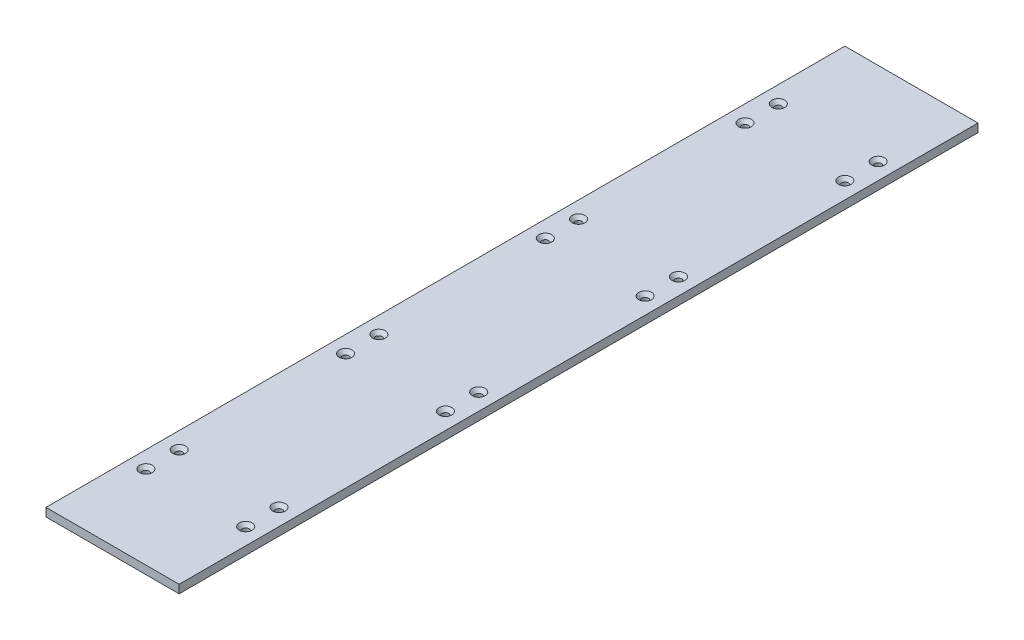
ISO-10303-21;
HEADER;
FILE_DESCRIPTION(('STEP AP214'),'2;1');
FILE_NAME('part.step','',(''),(''),'','','');
FILE_SCHEMA(('AUTOMOTIVE_DESIGN { 1 0 10303 214 1 1 1 1 }'));
ENDSEC;
DATA;
#1=APPLICATION_CONTEXT('core data for automotive mechanical design processes');
#2=APPLICATION_PROTOCOL_DEFINITION('international standard','automotive_design',2000,#1);
#3=PRODUCT_CONTEXT('',#1,'mechanical');
#4=PRODUCT('Part','Part','',(#3));
#5=PRODUCT_RELATED_PRODUCT_CATEGORY('part','',(#4));
#6=PRODUCT_DEFINITION_FORMATION('','',#4);
#7=PRODUCT_DEFINITION_CONTEXT('part definition',#1,'design');
#8=PRODUCT_DEFINITION('design','',#6,#7);
#9=PRODUCT_DEFINITION_SHAPE('','',#8);
#10=(LENGTH_UNIT() NAMED_UNIT(*) SI_UNIT(.MILLI.,.METRE.));
#11=(NAMED_UNIT(*) PLANE_ANGLE_UNIT() SI_UNIT($,.RADIAN.));
#12=(NAMED_UNIT(*) SI_UNIT($,.STERADIAN.) SOLID_ANGLE_UNIT());
#13=UNCERTAINTY_MEASURE_WITH_UNIT(LENGTH_MEASURE(1.E-05),#10,'distance_accuracy_value','');
#14=(GEOMETRIC_REPRESENTATION_CONTEXT(3) GLOBAL_UNCERTAINTY_ASSIGNED_CONTEXT((#13)) GLOBAL_UNIT_ASSIGNED_CONTEXT((#10,
#11,#12)) REPRESENTATION_CONTEXT('',''));
#15=CARTESIAN_POINT('',(0.,0.,0.));
#16=DIRECTION('',(0.,0.,1.));
#17=DIRECTION('',(1.,0.,0.));
#18=AXIS2_PLACEMENT_3D('',#15,#16,#17);
#19=CARTESIAN_POINT('',(50.8,3.175,304.8));
#20=DIRECTION('',(-1.,0.,0.));
#21=DIRECTION('',(0.,0.,1.));
#22=AXIS2_PLACEMENT_3D('',#19,#20,#21);
#23=PLANE('',#22);
#24=DIRECTION('',(0.,0.,-1.));
#25=VECTOR('',#24,1.);
#26=CARTESIAN_POINT('',(50.8,-3.175,304.8));
#27=LINE('',#26,#25);
#28=CARTESIAN_POINT('',(50.8,-3.175,304.8));
#29=VERTEX_POINT('',#28);
#30=CARTESIAN_POINT('',(50.8,-3.175,-304.8));
#31=VERTEX_POINT('',#30);
#32=EDGE_CURVE('E107',#29,#31,#27,.T.);
#33=ORIENTED_EDGE('',*,*,#32,.T.);
#34=DIRECTION('',(0.,-1.,0.));
#35=VECTOR('',#34,1.);
#36=CARTESIAN_POINT('',(50.8,3.175,-304.8));
#37=LINE('',#36,#35);
#38=CARTESIAN_POINT('',(50.8,3.175,-304.8));
#39=VERTEX_POINT('',#38);
#40=EDGE_CURVE('E11',#39,#31,#37,.T.);
#41=ORIENTED_EDGE('',*,*,#40,.F.);
#42=DIRECTION('',(0.,0.,-1.));
#43=VECTOR('',#42,1.);
#44=CARTESIAN_POINT('',(50.8,3.175,304.8));
#45=LINE('',#44,#43);
#46=CARTESIAN_POINT('',(50.8,3.175,304.8));
#47=VERTEX_POINT('',#46);
#48=EDGE_CURVE('E91',#47,#39,#45,.T.);
#49=ORIENTED_EDGE('',*,*,#48,.F.);
#50=DIRECTION('',(0.,-1.,0.));
#51=VECTOR('',#50,1.);
#52=CARTESIAN_POINT('',(50.8,3.175,304.8));
#53=LINE('',#52,#51);
#54=EDGE_CURVE('E103',#47,#29,#53,.T.);
#55=ORIENTED_EDGE('',*,*,#54,.T.);
#56=EDGE_LOOP('',(#33,#41,#49,#55));
#57=FACE_BOUND('',#56,.T.);
#58=ADVANCED_FACE('F39',(#57),#23,.F.);
#59=CARTESIAN_POINT('',(-50.8,3.175,-304.8));
#60=DIRECTION('',(0.,0.,1.));
#61=DIRECTION('',(1.,0.,0.));
#62=AXIS2_PLACEMENT_3D('',#59,#60,#61);
#63=PLANE('',#62);
#64=DIRECTION('',(-1.,0.,0.));
#65=VECTOR('',#64,1.);
#66=CARTESIAN_POINT('',(-50.8,-3.175,-304.8));
#67=LINE('',#66,#65);
#68=CARTESIAN_POINT('',(-50.8,-3.175,-304.8));
#69=VERTEX_POINT('',#68);
#70=EDGE_CURVE('E96',#31,#69,#67,.T.);
#71=ORIENTED_EDGE('',*,*,#70,.T.);
#72=DIRECTION('',(0.,-1.,0.));
#73=VECTOR('',#72,1.);
#74=CARTESIAN_POINT('',(-50.8,3.175,-304.8));
#75=LINE('',#74,#73);
#76=CARTESIAN_POINT('',(-50.8,3.175,-304.8));
#77=VERTEX_POINT('',#76);
#78=EDGE_CURVE('E48',#77,#69,#75,.T.);
#79=ORIENTED_EDGE('',*,*,#78,.F.);
#80=DIRECTION('',(-1.,0.,0.));
#81=VECTOR('',#80,1.);
#82=CARTESIAN_POINT('',(-50.8,3.175,-304.8));
#83=LINE('',#82,#81);
#84=EDGE_CURVE('E86',#39,#77,#83,.T.);
#85=ORIENTED_EDGE('',*,*,#84,.F.);
#86=ORIENTED_EDGE('',*,*,#40,.T.);
#87=EDGE_LOOP('',(#71,#79,#85,#86));
#88=FACE_BOUND('',#87,.T.);
#89=ADVANCED_FACE('F95',(#88),#63,.F.);
#90=CARTESIAN_POINT('',(-50.8,3.175,304.8));
#91=DIRECTION('',(1.,0.,0.));
#92=DIRECTION('',(0.,0.,-1.));
#93=AXIS2_PLACEMENT_3D('',#90,#91,#92);
#94=PLANE('',#93);
#95=DIRECTION('',(0.,0.,1.));
#96=VECTOR('',#95,1.);
#97=CARTESIAN_POINT('',(-50.8,-3.175,304.8));
#98=LINE('',#97,#96);
#99=CARTESIAN_POINT('',(-50.8,-3.175,304.8));
#100=VERTEX_POINT('',#99);
#101=EDGE_CURVE('E73',#69,#100,#98,.T.);
#102=ORIENTED_EDGE('',*,*,#101,.T.);
#103=DIRECTION('',(0.,-1.,0.));
#104=VECTOR('',#103,1.);
#105=CARTESIAN_POINT('',(-50.8,3.175,304.8));
#106=LINE('',#105,#104);
#107=CARTESIAN_POINT('',(-50.8,3.175,304.8));
#108=VERTEX_POINT('',#107);
#109=EDGE_CURVE('E98',#108,#100,#106,.T.);
#110=ORIENTED_EDGE('',*,*,#109,.F.);
#111=DIRECTION('',(0.,0.,1.));
#112=VECTOR('',#111,1.);
#113=CARTESIAN_POINT('',(-50.8,3.175,304.8));
#114=LINE('',#113,#112);
#115=EDGE_CURVE('E89',#77,#108,#114,.T.);
#116=ORIENTED_EDGE('',*,*,#115,.F.);
#117=ORIENTED_EDGE('',*,*,#78,.T.);
#118=EDGE_LOOP('',(#102,#110,#116,#117));
#119=FACE_BOUND('',#118,.T.);
#120=ADVANCED_FACE('F99',(#119),#94,.F.);
#121=CARTESIAN_POINT('',(-50.8,3.175,304.8));
#122=DIRECTION('',(0.,0.,-1.));
#123=DIRECTION('',(-1.,0.,0.));
#124=AXIS2_PLACEMENT_3D('',#121,#122,#123);
#125=PLANE('',#124);
#126=DIRECTION('',(1.,0.,0.));
#127=VECTOR('',#126,1.);
#128=CARTESIAN_POINT('',(-50.8,-3.175,304.8));
#129=LINE('',#128,#127);
#130=EDGE_CURVE('E79',#100,#29,#129,.T.);
#131=ORIENTED_EDGE('',*,*,#130,.T.);
#132=ORIENTED_EDGE('',*,*,#54,.F.);
#133=DIRECTION('',(1.,0.,0.));
#134=VECTOR('',#133,1.);
#135=CARTESIAN_POINT('',(-50.8,3.175,304.8));
#136=LINE('',#135,#134);
#137=EDGE_CURVE('E56',#108,#47,#136,.T.);
#138=ORIENTED_EDGE('',*,*,#137,.F.);
#139=ORIENTED_EDGE('',*,*,#109,.T.);
#140=EDGE_LOOP('',(#131,#132,#138,#139));
#141=FACE_BOUND('',#140,.T.);
#142=ADVANCED_FACE('F121',(#141),#125,.F.);
#143=CARTESIAN_POINT('',(0.,3.175,0.));
#144=DIRECTION('',(0.,-1.,0.));
#145=DIRECTION('',(0.,0.,-1.));
#146=AXIS2_PLACEMENT_3D('',#143,#144,#145);
#147=PLANE('',#146);
#148=CARTESIAN_POINT('',(38.1,3.175,88.8999999999999));
#149=DIRECTION('',(0.,1.,0.));
#150=DIRECTION('',(0.,0.,1.));
#151=AXIS2_PLACEMENT_3D('',#148,#149,#150);
#152=CIRCLE('',#151,4.8895);
#153=CARTESIAN_POINT('',(38.1,3.175,93.7894999999999));
#154=VERTEX_POINT('',#153);
#155=EDGE_CURVE('E315',#154,#154,#152,.T.);
#156=ORIENTED_EDGE('',*,*,#155,.F.);
#157=EDGE_LOOP('',(#156));
#158=FACE_BOUND('',#157,.T.);
#159=CARTESIAN_POINT('',(38.1,3.175,63.4999999999999));
#160=DIRECTION('',(0.,1.,0.));
#161=DIRECTION('',(0.,0.,1.));
#162=AXIS2_PLACEMENT_3D('',#159,#160,#161);
#163=CIRCLE('',#162,4.8895);
#164=CARTESIAN_POINT('',(38.1,3.175,68.3894999999999));
#165=VERTEX_POINT('',#164);
#166=EDGE_CURVE('E303',#165,#165,#163,.T.);
#167=ORIENTED_EDGE('',*,*,#166,.F.);
#168=EDGE_LOOP('',(#167));
#169=FACE_BOUND('',#168,.T.);
#170=CARTESIAN_POINT('',(38.1,3.175,215.9));
#171=DIRECTION('',(0.,1.,0.));
#172=DIRECTION('',(0.,0.,1.));
#173=AXIS2_PLACEMENT_3D('',#170,#171,#172);
#174=CIRCLE('',#173,4.8895);
#175=CARTESIAN_POINT('',(38.1,3.175,220.7895));
#176=VERTEX_POINT('',#175);
#177=EDGE_CURVE('E291',#176,#176,#174,.T.);
#178=ORIENTED_EDGE('',*,*,#177,.F.);
#179=EDGE_LOOP('',(#178));
#180=FACE_BOUND('',#179,.T.);
#181=CARTESIAN_POINT('',(38.1,3.175,241.3));
#182=DIRECTION('',(0.,1.,0.));
#183=DIRECTION('',(0.,0.,1.));
#184=AXIS2_PLACEMENT_3D('',#181,#182,#183);
#185=CIRCLE('',#184,4.8895);
#186=CARTESIAN_POINT('',(38.1,3.175,246.1895));
#187=VERTEX_POINT('',#186);
#188=EDGE_CURVE('E279',#187,#187,#185,.T.);
#189=ORIENTED_EDGE('',*,*,#188,.F.);
#190=EDGE_LOOP('',(#189));
#191=FACE_BOUND('',#190,.T.);
#192=CARTESIAN_POINT('',(38.1,3.175,-88.8999999999999));
#193=DIRECTION('',(0.,1.,0.));
#194=DIRECTION('',(0.,0.,1.));
#195=AXIS2_PLACEMENT_3D('',#192,#193,#194);
#196=CIRCLE('',#195,4.8895);
#197=CARTESIAN_POINT('',(38.1,3.175,-84.0105));
#198=VERTEX_POINT('',#197);
#199=EDGE_CURVE('E267',#198,#198,#196,.T.);
#200=ORIENTED_EDGE('',*,*,#199,.F.);
#201=EDGE_LOOP('',(#200));
#202=FACE_BOUND('',#201,.T.);
#203=CARTESIAN_POINT('',(38.1,3.175,-63.4999999999999));
#204=DIRECTION('',(0.,1.,0.));
#205=DIRECTION('',(0.,0.,1.));
#206=AXIS2_PLACEMENT_3D('',#203,#204,#205);
#207=CIRCLE('',#206,4.8895);
#208=CARTESIAN_POINT('',(38.1,3.175,-58.6104999999999));
#209=VERTEX_POINT('',#208);
#210=EDGE_CURVE('E255',#209,#209,#207,.T.);
#211=ORIENTED_EDGE('',*,*,#210,.F.);
#212=EDGE_LOOP('',(#211));
#213=FACE_BOUND('',#212,.T.);
#214=CARTESIAN_POINT('',(38.1,3.175,-215.9));
#215=DIRECTION('',(0.,1.,0.));
#216=DIRECTION('',(0.,0.,1.));
#217=AXIS2_PLACEMENT_3D('',#214,#215,#216);
#218=CIRCLE('',#217,4.8895);
#219=CARTESIAN_POINT('',(38.1,3.175,-211.0105));
#220=VERTEX_POINT('',#219);
#221=EDGE_CURVE('E243',#220,#220,#218,.T.);
#222=ORIENTED_EDGE('',*,*,#221,.F.);
#223=EDGE_LOOP('',(#222));
#224=FACE_BOUND('',#223,.T.);
#225=CARTESIAN_POINT('',(38.1,3.175,-241.3));
#226=DIRECTION('',(0.,1.,0.));
#227=DIRECTION('',(0.,0.,1.));
#228=AXIS2_PLACEMENT_3D('',#225,#226,#227);
#229=CIRCLE('',#228,4.8895);
#230=CARTESIAN_POINT('',(38.1,3.175,-236.4105));
#231=VERTEX_POINT('',#230);
#232=EDGE_CURVE('E231',#231,#231,#229,.T.);
#233=ORIENTED_EDGE('',*,*,#232,.F.);
#234=EDGE_LOOP('',(#233));
#235=FACE_BOUND('',#234,.T.);
#236=CARTESIAN_POINT('',(-38.1,3.175,-88.8999999999999));
#237=DIRECTION('',(0.,1.,0.));
#238=DIRECTION('',(0.,0.,1.));
#239=AXIS2_PLACEMENT_3D('',#236,#237,#238);
#240=CIRCLE('',#239,4.8895);
#241=CARTESIAN_POINT('',(-38.1,3.175,-84.0105));
#242=VERTEX_POINT('',#241);
#243=EDGE_CURVE('E219',#242,#242,#240,.T.);
#244=ORIENTED_EDGE('',*,*,#243,.F.);
#245=EDGE_LOOP('',(#244));
#246=FACE_BOUND('',#245,.T.);
#247=CARTESIAN_POINT('',(-38.1,3.175,-63.4999999999999));
#248=DIRECTION('',(0.,1.,0.));
#249=DIRECTION('',(0.,0.,1.));
#250=AXIS2_PLACEMENT_3D('',#247,#248,#249);
#251=CIRCLE('',#250,4.8895);
#252=CARTESIAN_POINT('',(-38.1,3.175,-58.6104999999999));
#253=VERTEX_POINT('',#252);
#254=EDGE_CURVE('E207',#253,#253,#251,.T.);
#255=ORIENTED_EDGE('',*,*,#254,.F.);
#256=EDGE_LOOP('',(#255));
#257=FACE_BOUND('',#256,.T.);
#258=CARTESIAN_POINT('',(-38.1,3.175,-215.9));
#259=DIRECTION('',(0.,1.,0.));
#260=DIRECTION('',(0.,0.,1.));
#261=AXIS2_PLACEMENT_3D('',#258,#259,#260);
#262=CIRCLE('',#261,4.8895);
#263=CARTESIAN_POINT('',(-38.1,3.175,-211.0105));
#264=VERTEX_POINT('',#263);
#265=EDGE_CURVE('E195',#264,#264,#262,.T.);
#266=ORIENTED_EDGE('',*,*,#265,.F.);
#267=EDGE_LOOP('',(#266));
#268=FACE_BOUND('',#267,.T.);
#269=CARTESIAN_POINT('',(-38.1,3.175,-241.3));
#270=DIRECTION('',(0.,1.,0.));
#271=DIRECTION('',(0.,0.,1.));
#272=AXIS2_PLACEMENT_3D('',#269,#270,#271);
#273=CIRCLE('',#272,4.8895);
#274=CARTESIAN_POINT('',(-38.1,3.175,-236.4105));
#275=VERTEX_POINT('',#274);
#276=EDGE_CURVE('E183',#275,#275,#273,.T.);
#277=ORIENTED_EDGE('',*,*,#276,.F.);
#278=EDGE_LOOP('',(#277));
#279=FACE_BOUND('',#278,.T.);
#280=CARTESIAN_POINT('',(-38.1,3.175,88.8999999999999));
#281=DIRECTION('',(0.,1.,0.));
#282=DIRECTION('',(0.,0.,1.));
#283=AXIS2_PLACEMENT_3D('',#280,#281,#282);
#284=CIRCLE('',#283,4.8895);
#285=CARTESIAN_POINT('',(-38.1,3.175,93.7894999999999));
#286=VERTEX_POINT('',#285);
#287=EDGE_CURVE('E171',#286,#286,#284,.T.);
#288=ORIENTED_EDGE('',*,*,#287,.F.);
#289=EDGE_LOOP('',(#288));
#290=FACE_BOUND('',#289,.T.);
#291=CARTESIAN_POINT('',(-38.1,3.175,63.4999999999999));
#292=DIRECTION('',(0.,1.,0.));
#293=DIRECTION('',(0.,0.,1.));
#294=AXIS2_PLACEMENT_3D('',#291,#292,#293);
#295=CIRCLE('',#294,4.8895);
#296=CARTESIAN_POINT('',(-38.1,3.175,68.3894999999999));
#297=VERTEX_POINT('',#296);
#298=EDGE_CURVE('E159',#297,#297,#295,.T.);
#299=ORIENTED_EDGE('',*,*,#298,.F.);
#300=EDGE_LOOP('',(#299));
#301=FACE_BOUND('',#300,.T.);
#302=CARTESIAN_POINT('',(-38.1,3.175,215.9));
#303=DIRECTION('',(0.,1.,0.));
#304=DIRECTION('',(0.,0.,1.));
#305=AXIS2_PLACEMENT_3D('',#302,#303,#304);
#306=CIRCLE('',#305,4.8895);
#307=CARTESIAN_POINT('',(-38.1,3.175,220.7895));
#308=VERTEX_POINT('',#307);
#309=EDGE_CURVE('E147',#308,#308,#306,.T.);
#310=ORIENTED_EDGE('',*,*,#309,.F.);
#311=EDGE_LOOP('',(#310));
#312=FACE_BOUND('',#311,.T.);
#313=CARTESIAN_POINT('',(-38.1,3.175,241.3));
#314=DIRECTION('',(0.,1.,0.));
#315=DIRECTION('',(0.,0.,1.));
#316=AXIS2_PLACEMENT_3D('',#313,#314,#315);
#317=CIRCLE('',#316,4.8895);
#318=CARTESIAN_POINT('',(-38.1,3.175,246.1895));
#319=VERTEX_POINT('',#318);
#320=EDGE_CURVE('E135',#319,#319,#317,.T.);
#321=ORIENTED_EDGE('',*,*,#320,.F.);
#322=EDGE_LOOP('',(#321));
#323=FACE_BOUND('',#322,.T.);
#324=ORIENTED_EDGE('',*,*,#48,.T.);
#325=ORIENTED_EDGE('',*,*,#84,.T.);
#326=ORIENTED_EDGE('',*,*,#115,.T.);
#327=ORIENTED_EDGE('',*,*,#137,.T.);
#328=EDGE_LOOP('',(#324,#325,#326,#327));
#329=FACE_BOUND('',#328,.T.);
#330=ADVANCED_FACE('F87',(#158,#169,#180,#191,#202,#213,#224,#235,#246,#257,#268,#279,#290,#301,
#312,#323,#329),#147,.F.);
#331=CARTESIAN_POINT('',(0.,-3.175,0.));
#332=DIRECTION('',(0.,-1.,0.));
#333=DIRECTION('',(0.,0.,-1.));
#334=AXIS2_PLACEMENT_3D('',#331,#332,#333);
#335=PLANE('',#334);
#336=CARTESIAN_POINT('',(38.1,-3.175,88.8999999999999));
#337=DIRECTION('',(0.,1.,0.));
#338=DIRECTION('',(0.,0.,1.));
#339=AXIS2_PLACEMENT_3D('',#336,#337,#338);
#340=CIRCLE('',#339,2.5527);
#341=CARTESIAN_POINT('',(38.1,-3.175,91.4526999999999));
#342=VERTEX_POINT('',#341);
#343=EDGE_CURVE('E307',#342,#342,#340,.T.);
#344=ORIENTED_EDGE('',*,*,#343,.T.);
#345=EDGE_LOOP('',(#344));
#346=FACE_BOUND('',#345,.T.);
#347=CARTESIAN_POINT('',(38.1,-3.175,63.4999999999999));
#348=DIRECTION('',(0.,1.,0.));
#349=DIRECTION('',(0.,0.,1.));
#350=AXIS2_PLACEMENT_3D('',#347,#348,#349);
#351=CIRCLE('',#350,2.5527);
#352=CARTESIAN_POINT('',(38.1,-3.175,66.0526999999999));
#353=VERTEX_POINT('',#352);
#354=EDGE_CURVE('E295',#353,#353,#351,.T.);
#355=ORIENTED_EDGE('',*,*,#354,.T.);
#356=EDGE_LOOP('',(#355));
#357=FACE_BOUND('',#356,.T.);
#358=CARTESIAN_POINT('',(38.1,-3.175,215.9));
#359=DIRECTION('',(0.,1.,0.));
#360=DIRECTION('',(0.,0.,1.));
#361=AXIS2_PLACEMENT_3D('',#358,#359,#360);
#362=CIRCLE('',#361,2.5527);
#363=CARTESIAN_POINT('',(38.1,-3.175,218.4527));
#364=VERTEX_POINT('',#363);
#365=EDGE_CURVE('E283',#364,#364,#362,.T.);
#366=ORIENTED_EDGE('',*,*,#365,.T.);
#367=EDGE_LOOP('',(#366));
#368=FACE_BOUND('',#367,.T.);
#369=CARTESIAN_POINT('',(38.1,-3.175,241.3));
#370=DIRECTION('',(0.,1.,0.));
#371=DIRECTION('',(0.,0.,1.));
#372=AXIS2_PLACEMENT_3D('',#369,#370,#371);
#373=CIRCLE('',#372,2.5527);
#374=CARTESIAN_POINT('',(38.1,-3.175,243.8527));
#375=VERTEX_POINT('',#374);
#376=EDGE_CURVE('E271',#375,#375,#373,.T.);
#377=ORIENTED_EDGE('',*,*,#376,.T.);
#378=EDGE_LOOP('',(#377));
#379=FACE_BOUND('',#378,.T.);
#380=CARTESIAN_POINT('',(38.1,-3.175,-88.8999999999999));
#381=DIRECTION('',(0.,1.,0.));
#382=DIRECTION('',(0.,0.,1.));
#383=AXIS2_PLACEMENT_3D('',#380,#381,#382);
#384=CIRCLE('',#383,2.5527);
#385=CARTESIAN_POINT('',(38.1,-3.175,-86.3473));
#386=VERTEX_POINT('',#385);
#387=EDGE_CURVE('E259',#386,#386,#384,.T.);
#388=ORIENTED_EDGE('',*,*,#387,.T.);
#389=EDGE_LOOP('',(#388));
#390=FACE_BOUND('',#389,.T.);
#391=CARTESIAN_POINT('',(38.1,-3.175,-63.4999999999999));
#392=DIRECTION('',(0.,1.,0.));
#393=DIRECTION('',(0.,0.,1.));
#394=AXIS2_PLACEMENT_3D('',#391,#392,#393);
#395=CIRCLE('',#394,2.5527);
#396=CARTESIAN_POINT('',(38.1,-3.175,-60.9472999999999));
#397=VERTEX_POINT('',#396);
#398=EDGE_CURVE('E247',#397,#397,#395,.T.);
#399=ORIENTED_EDGE('',*,*,#398,.T.);
#400=EDGE_LOOP('',(#399));
#401=FACE_BOUND('',#400,.T.);
#402=CARTESIAN_POINT('',(38.1,-3.175,-215.9));
#403=DIRECTION('',(0.,1.,0.));
#404=DIRECTION('',(0.,0.,1.));
#405=AXIS2_PLACEMENT_3D('',#402,#403,#404);
#406=CIRCLE('',#405,2.5527);
#407=CARTESIAN_POINT('',(38.1,-3.175,-213.3473));
#408=VERTEX_POINT('',#407);
#409=EDGE_CURVE('E235',#408,#408,#406,.T.);
#410=ORIENTED_EDGE('',*,*,#409,.T.);
#411=EDGE_LOOP('',(#410));
#412=FACE_BOUND('',#411,.T.);
#413=CARTESIAN_POINT('',(38.1,-3.175,-241.3));
#414=DIRECTION('',(0.,1.,0.));
#415=DIRECTION('',(0.,0.,1.));
#416=AXIS2_PLACEMENT_3D('',#413,#414,#415);
#417=CIRCLE('',#416,2.5527);
#418=CARTESIAN_POINT('',(38.1,-3.175,-238.7473));
#419=VERTEX_POINT('',#418);
#420=EDGE_CURVE('E223',#419,#419,#417,.T.);
#421=ORIENTED_EDGE('',*,*,#420,.T.);
#422=EDGE_LOOP('',(#421));
#423=FACE_BOUND('',#422,.T.);
#424=CARTESIAN_POINT('',(-38.1,-3.175,-88.8999999999999));
#425=DIRECTION('',(0.,1.,0.));
#426=DIRECTION('',(0.,0.,1.));
#427=AXIS2_PLACEMENT_3D('',#424,#425,#426);
#428=CIRCLE('',#427,2.5527);
#429=CARTESIAN_POINT('',(-38.1,-3.175,-86.3473));
#430=VERTEX_POINT('',#429);
#431=EDGE_CURVE('E211',#430,#430,#428,.T.);
#432=ORIENTED_EDGE('',*,*,#431,.T.);
#433=EDGE_LOOP('',(#432));
#434=FACE_BOUND('',#433,.T.);
#435=CARTESIAN_POINT('',(-38.1,-3.175,-63.4999999999999));
#436=DIRECTION('',(0.,1.,0.));
#437=DIRECTION('',(0.,0.,1.));
#438=AXIS2_PLACEMENT_3D('',#435,#436,#437);
#439=CIRCLE('',#438,2.5527);
#440=CARTESIAN_POINT('',(-38.1,-3.175,-60.9472999999999));
#441=VERTEX_POINT('',#440);
#442=EDGE_CURVE('E199',#441,#441,#439,.T.);
#443=ORIENTED_EDGE('',*,*,#442,.T.);
#444=EDGE_LOOP('',(#443));
#445=FACE_BOUND('',#444,.T.);
#446=CARTESIAN_POINT('',(-38.1,-3.175,-215.9));
#447=DIRECTION('',(0.,1.,0.));
#448=DIRECTION('',(0.,0.,1.));
#449=AXIS2_PLACEMENT_3D('',#446,#447,#448);
#450=CIRCLE('',#449,2.5527);
#451=CARTESIAN_POINT('',(-38.1,-3.175,-213.3473));
#452=VERTEX_POINT('',#451);
#453=EDGE_CURVE('E187',#452,#452,#450,.T.);
#454=ORIENTED_EDGE('',*,*,#453,.T.);
#455=EDGE_LOOP('',(#454));
#456=FACE_BOUND('',#455,.T.);
#457=CARTESIAN_POINT('',(-38.1,-3.175,-241.3));
#458=DIRECTION('',(0.,1.,0.));
#459=DIRECTION('',(0.,0.,1.));
#460=AXIS2_PLACEMENT_3D('',#457,#458,#459);
#461=CIRCLE('',#460,2.5527);
#462=CARTESIAN_POINT('',(-38.1,-3.175,-238.7473));
#463=VERTEX_POINT('',#462);
#464=EDGE_CURVE('E175',#463,#463,#461,.T.);
#465=ORIENTED_EDGE('',*,*,#464,.T.);
#466=EDGE_LOOP('',(#465));
#467=FACE_BOUND('',#466,.T.);
#468=CARTESIAN_POINT('',(-38.1,-3.175,88.8999999999999));
#469=DIRECTION('',(0.,1.,0.));
#470=DIRECTION('',(0.,0.,1.));
#471=AXIS2_PLACEMENT_3D('',#468,#469,#470);
#472=CIRCLE('',#471,2.5527);
#473=CARTESIAN_POINT('',(-38.1,-3.175,91.4526999999999));
#474=VERTEX_POINT('',#473);
#475=EDGE_CURVE('E163',#474,#474,#472,.T.);
#476=ORIENTED_EDGE('',*,*,#475,.T.);
#477=EDGE_LOOP('',(#476));
#478=FACE_BOUND('',#477,.T.);
#479=CARTESIAN_POINT('',(-38.1,-3.175,63.4999999999999));
#480=DIRECTION('',(0.,1.,0.));
#481=DIRECTION('',(0.,0.,1.));
#482=AXIS2_PLACEMENT_3D('',#479,#480,#481);
#483=CIRCLE('',#482,2.5527);
#484=CARTESIAN_POINT('',(-38.1,-3.175,66.0526999999999));
#485=VERTEX_POINT('',#484);
#486=EDGE_CURVE('E151',#485,#485,#483,.T.);
#487=ORIENTED_EDGE('',*,*,#486,.T.);
#488=EDGE_LOOP('',(#487));
#489=FACE_BOUND('',#488,.T.);
#490=CARTESIAN_POINT('',(-38.1,-3.175,215.9));
#491=DIRECTION('',(0.,1.,0.));
#492=DIRECTION('',(0.,0.,1.));
#493=AXIS2_PLACEMENT_3D('',#490,#491,#492);
#494=CIRCLE('',#493,2.5527);
#495=CARTESIAN_POINT('',(-38.1,-3.175,218.4527));
#496=VERTEX_POINT('',#495);
#497=EDGE_CURVE('E139',#496,#496,#494,.T.);
#498=ORIENTED_EDGE('',*,*,#497,.T.);
#499=EDGE_LOOP('',(#498));
#500=FACE_BOUND('',#499,.T.);
#501=CARTESIAN_POINT('',(-38.1,-3.175,241.3));
#502=DIRECTION('',(0.,1.,0.));
#503=DIRECTION('',(0.,0.,1.));
#504=AXIS2_PLACEMENT_3D('',#501,#502,#503);
#505=CIRCLE('',#504,2.5527);
#506=CARTESIAN_POINT('',(-38.1,-3.175,243.8527));
#507=VERTEX_POINT('',#506);
#508=EDGE_CURVE('E111',#507,#507,#505,.T.);
#509=ORIENTED_EDGE('',*,*,#508,.T.);
#510=EDGE_LOOP('',(#509));
#511=FACE_BOUND('',#510,.T.);
#512=ORIENTED_EDGE('',*,*,#32,.F.);
#513=ORIENTED_EDGE('',*,*,#130,.F.);
#514=ORIENTED_EDGE('',*,*,#101,.F.);
#515=ORIENTED_EDGE('',*,*,#70,.F.);
#516=EDGE_LOOP('',(#512,#513,#514,#515));
#517=FACE_BOUND('',#516,.T.);
#518=ADVANCED_FACE('F124',(#346,#357,#368,#379,#390,#401,#412,#423,#434,#445,#456,#467,#478,
#489,#500,#511,#517),#335,.T.);
#519=CARTESIAN_POINT('',(-38.1,3.175,241.3));
#520=DIRECTION('',(0.,1.,0.));
#521=DIRECTION('',(0.,0.,1.));
#522=AXIS2_PLACEMENT_3D('',#519,#520,#521);
#523=CYLINDRICAL_SURFACE('',#522,2.5527);
#524=ORIENTED_EDGE('',*,*,#508,.F.);
#525=EDGE_LOOP('',(#524));
#526=FACE_BOUND('',#525,.T.);
#527=CARTESIAN_POINT('',(-38.1,0.486819106005946,241.3));
#528=DIRECTION('',(0.,1.,0.));
#529=DIRECTION('',(0.,0.,1.));
#530=AXIS2_PLACEMENT_3D('',#527,#528,#529);
#531=CIRCLE('',#530,2.5527);
#532=CARTESIAN_POINT('',(-38.1,0.486819106005946,243.8527));
#533=VERTEX_POINT('',#532);
#534=EDGE_CURVE('E131',#533,#533,#531,.T.);
#535=ORIENTED_EDGE('',*,*,#534,.T.);
#536=EDGE_LOOP('',(#535));
#537=FACE_BOUND('',#536,.T.);
#538=ADVANCED_FACE('F358',(#526,#537),#523,.F.);
#539=CARTESIAN_POINT('',(-38.1,3.175,241.3));
#540=DIRECTION('',(0.,1.,0.));
#541=DIRECTION('',(0.,0.,1.));
#542=AXIS2_PLACEMENT_3D('',#539,#540,#541);
#543=CONICAL_SURFACE('',#542,4.8895,0.715584993317675);
#544=ORIENTED_EDGE('',*,*,#534,.F.);
#545=EDGE_LOOP('',(#544));
#546=FACE_BOUND('',#545,.T.);
#547=ORIENTED_EDGE('',*,*,#320,.T.);
#548=EDGE_LOOP('',(#547));
#549=FACE_BOUND('',#548,.T.);
#550=ADVANCED_FACE('F355',(#546,#549),#543,.F.);
#551=CARTESIAN_POINT('',(-38.1,3.175,215.9));
#552=DIRECTION('',(0.,1.,0.));
#553=DIRECTION('',(0.,0.,1.));
#554=AXIS2_PLACEMENT_3D('',#551,#552,#553);
#555=CYLINDRICAL_SURFACE('',#554,2.5527);
#556=ORIENTED_EDGE('',*,*,#497,.F.);
#557=EDGE_LOOP('',(#556));
#558=FACE_BOUND('',#557,.T.);
#559=CARTESIAN_POINT('',(-38.1,0.486819106005946,215.9));
#560=DIRECTION('',(0.,1.,0.));
#561=DIRECTION('',(0.,0.,1.));
#562=AXIS2_PLACEMENT_3D('',#559,#560,#561);
#563=CIRCLE('',#562,2.5527);
#564=CARTESIAN_POINT('',(-38.1,0.486819106005946,218.4527));
#565=VERTEX_POINT('',#564);
#566=EDGE_CURVE('E143',#565,#565,#563,.T.);
#567=ORIENTED_EDGE('',*,*,#566,.T.);
#568=EDGE_LOOP('',(#567));
#569=FACE_BOUND('',#568,.T.);
#570=ADVANCED_FACE('F357',(#558,#569),#555,.F.);
#571=CARTESIAN_POINT('',(-38.1,3.175,215.9));
#572=DIRECTION('',(0.,1.,0.));
#573=DIRECTION('',(0.,0.,1.));
#574=AXIS2_PLACEMENT_3D('',#571,#572,#573);
#575=CONICAL_SURFACE('',#574,4.8895,0.715584993317675);
#576=ORIENTED_EDGE('',*,*,#566,.F.);
#577=EDGE_LOOP('',(#576));
#578=FACE_BOUND('',#577,.T.);
#579=ORIENTED_EDGE('',*,*,#309,.T.);
#580=EDGE_LOOP('',(#579));
#581=FACE_BOUND('',#580,.T.);
#582=ADVANCED_FACE('F365',(#578,#581),#575,.F.);
#583=CARTESIAN_POINT('',(-38.1,3.175,63.4999999999999));
#584=DIRECTION('',(0.,1.,0.));
#585=DIRECTION('',(0.,0.,1.));
#586=AXIS2_PLACEMENT_3D('',#583,#584,#585);
#587=CYLINDRICAL_SURFACE('',#586,2.5527);
#588=ORIENTED_EDGE('',*,*,#486,.F.);
#589=EDGE_LOOP('',(#588));
#590=FACE_BOUND('',#589,.T.);
#591=CARTESIAN_POINT('',(-38.1,0.486819106005946,63.4999999999999));
#592=DIRECTION('',(0.,1.,0.));
#593=DIRECTION('',(0.,0.,1.));
#594=AXIS2_PLACEMENT_3D('',#591,#592,#593);
#595=CIRCLE('',#594,2.5527);
#596=CARTESIAN_POINT('',(-38.1,0.486819106005946,66.0526999999999));
#597=VERTEX_POINT('',#596);
#598=EDGE_CURVE('E155',#597,#597,#595,.T.);
#599=ORIENTED_EDGE('',*,*,#598,.T.);
#600=EDGE_LOOP('',(#599));
#601=FACE_BOUND('',#600,.T.);
#602=ADVANCED_FACE('F423',(#590,#601),#587,.F.);
#603=CARTESIAN_POINT('',(-38.1,3.175,63.4999999999999));
#604=DIRECTION('',(0.,1.,0.));
#605=DIRECTION('',(0.,0.,1.));
#606=AXIS2_PLACEMENT_3D('',#603,#604,#605);
#607=CONICAL_SURFACE('',#606,4.8895,0.715584993317675);
#608=ORIENTED_EDGE('',*,*,#598,.F.);
#609=EDGE_LOOP('',(#608));
#610=FACE_BOUND('',#609,.T.);
#611=ORIENTED_EDGE('',*,*,#298,.T.);
#612=EDGE_LOOP('',(#611));
#613=FACE_BOUND('',#612,.T.);
#614=ADVANCED_FACE('F428',(#610,#613),#607,.F.);
#615=CARTESIAN_POINT('',(-38.1,3.175,88.8999999999999));
#616=DIRECTION('',(0.,1.,0.));
#617=DIRECTION('',(0.,0.,1.));
#618=AXIS2_PLACEMENT_3D('',#615,#616,#617);
#619=CYLINDRICAL_SURFACE('',#618,2.5527);
#620=ORIENTED_EDGE('',*,*,#475,.F.);
#621=EDGE_LOOP('',(#620));
#622=FACE_BOUND('',#621,.T.);
#623=CARTESIAN_POINT('',(-38.1,0.486819106005946,88.8999999999999));
#624=DIRECTION('',(0.,1.,0.));
#625=DIRECTION('',(0.,0.,1.));
#626=AXIS2_PLACEMENT_3D('',#623,#624,#625);
#627=CIRCLE('',#626,2.5527);
#628=CARTESIAN_POINT('',(-38.1,0.486819106005946,91.4526999999999));
#629=VERTEX_POINT('',#628);
#630=EDGE_CURVE('E167',#629,#629,#627,.T.);
#631=ORIENTED_EDGE('',*,*,#630,.T.);
#632=EDGE_LOOP('',(#631));
#633=FACE_BOUND('',#632,.T.);
#634=ADVANCED_FACE('F434',(#622,#633),#619,.F.);
#635=CARTESIAN_POINT('',(-38.1,3.175,88.8999999999999));
#636=DIRECTION('',(0.,1.,0.));
#637=DIRECTION('',(0.,0.,1.));
#638=AXIS2_PLACEMENT_3D('',#635,#636,#637);
#639=CONICAL_SURFACE('',#638,4.8895,0.715584993317675);
#640=ORIENTED_EDGE('',*,*,#630,.F.);
#641=EDGE_LOOP('',(#640));
#642=FACE_BOUND('',#641,.T.);
#643=ORIENTED_EDGE('',*,*,#287,.T.);
#644=EDGE_LOOP('',(#643));
#645=FACE_BOUND('',#644,.T.);
#646=ADVANCED_FACE('F438',(#642,#645),#639,.F.);
#647=CARTESIAN_POINT('',(-38.1,3.175,-241.3));
#648=DIRECTION('',(0.,1.,0.));
#649=DIRECTION('',(0.,0.,1.));
#650=AXIS2_PLACEMENT_3D('',#647,#648,#649);
#651=CYLINDRICAL_SURFACE('',#650,2.5527);
#652=ORIENTED_EDGE('',*,*,#464,.F.);
#653=EDGE_LOOP('',(#652));
#654=FACE_BOUND('',#653,.T.);
#655=CARTESIAN_POINT('',(-38.1,0.486819106005946,-241.3));
#656=DIRECTION('',(0.,1.,0.));
#657=DIRECTION('',(0.,0.,1.));
#658=AXIS2_PLACEMENT_3D('',#655,#656,#657);
#659=CIRCLE('',#658,2.5527);
#660=CARTESIAN_POINT('',(-38.1,0.486819106005946,-238.7473));
#661=VERTEX_POINT('',#660);
#662=EDGE_CURVE('E179',#661,#661,#659,.T.);
#663=ORIENTED_EDGE('',*,*,#662,.T.);
#664=EDGE_LOOP('',(#663));
#665=FACE_BOUND('',#664,.T.);
#666=ADVANCED_FACE('F442',(#654,#665),#651,.F.);
#667=CARTESIAN_POINT('',(-38.1,3.175,-241.3));
#668=DIRECTION('',(0.,1.,0.));
#669=DIRECTION('',(0.,0.,1.));
#670=AXIS2_PLACEMENT_3D('',#667,#668,#669);
#671=CONICAL_SURFACE('',#670,4.8895,0.715584993317675);
#672=ORIENTED_EDGE('',*,*,#662,.F.);
#673=EDGE_LOOP('',(#672));
#674=FACE_BOUND('',#673,.T.);
#675=ORIENTED_EDGE('',*,*,#276,.T.);
#676=EDGE_LOOP('',(#675));
#677=FACE_BOUND('',#676,.T.);
#678=ADVANCED_FACE('F446',(#674,#677),#671,.F.);
#679=CARTESIAN_POINT('',(-38.1,3.175,-215.9));
#680=DIRECTION('',(0.,1.,0.));
#681=DIRECTION('',(0.,0.,1.));
#682=AXIS2_PLACEMENT_3D('',#679,#680,#681);
#683=CYLINDRICAL_SURFACE('',#682,2.5527);
#684=ORIENTED_EDGE('',*,*,#453,.F.);
#685=EDGE_LOOP('',(#684));
#686=FACE_BOUND('',#685,.T.);
#687=CARTESIAN_POINT('',(-38.1,0.486819106005946,-215.9));
#688=DIRECTION('',(0.,1.,0.));
#689=DIRECTION('',(0.,0.,1.));
#690=AXIS2_PLACEMENT_3D('',#687,#688,#689);
#691=CIRCLE('',#690,2.5527);
#692=CARTESIAN_POINT('',(-38.1,0.486819106005946,-213.3473));
#693=VERTEX_POINT('',#692);
#694=EDGE_CURVE('E191',#693,#693,#691,.T.);
#695=ORIENTED_EDGE('',*,*,#694,.T.);
#696=EDGE_LOOP('',(#695));
#697=FACE_BOUND('',#696,.T.);
#698=ADVANCED_FACE('F450',(#686,#697),#683,.F.);
#699=CARTESIAN_POINT('',(-38.1,3.175,-215.9));
#700=DIRECTION('',(0.,1.,0.));
#701=DIRECTION('',(0.,0.,1.));
#702=AXIS2_PLACEMENT_3D('',#699,#700,#701);
#703=CONICAL_SURFACE('',#702,4.8895,0.715584993317675);
#704=ORIENTED_EDGE('',*,*,#694,.F.);
#705=EDGE_LOOP('',(#704));
#706=FACE_BOUND('',#705,.T.);
#707=ORIENTED_EDGE('',*,*,#265,.T.);
#708=EDGE_LOOP('',(#707));
#709=FACE_BOUND('',#708,.T.);
#710=ADVANCED_FACE('F454',(#706,#709),#703,.F.);
#711=CARTESIAN_POINT('',(-38.1,3.175,-63.4999999999999));
#712=DIRECTION('',(0.,1.,0.));
#713=DIRECTION('',(0.,0.,1.));
#714=AXIS2_PLACEMENT_3D('',#711,#712,#713);
#715=CYLINDRICAL_SURFACE('',#714,2.5527);
#716=ORIENTED_EDGE('',*,*,#442,.F.);
#717=EDGE_LOOP('',(#716));
#718=FACE_BOUND('',#717,.T.);
#719=CARTESIAN_POINT('',(-38.1,0.486819106005946,-63.4999999999999));
#720=DIRECTION('',(0.,1.,0.));
#721=DIRECTION('',(0.,0.,1.));
#722=AXIS2_PLACEMENT_3D('',#719,#720,#721);
#723=CIRCLE('',#722,2.5527);
#724=CARTESIAN_POINT('',(-38.1,0.486819106005946,-60.9472999999999));
#725=VERTEX_POINT('',#724);
#726=EDGE_CURVE('E203',#725,#725,#723,.T.);
#727=ORIENTED_EDGE('',*,*,#726,.T.);
#728=EDGE_LOOP('',(#727));
#729=FACE_BOUND('',#728,.T.);
#730=ADVANCED_FACE('F458',(#718,#729),#715,.F.);
#731=CARTESIAN_POINT('',(-38.1,3.175,-63.4999999999999));
#732=DIRECTION('',(0.,1.,0.));
#733=DIRECTION('',(0.,0.,1.));
#734=AXIS2_PLACEMENT_3D('',#731,#732,#733);
#735=CONICAL_SURFACE('',#734,4.8895,0.715584993317675);
#736=ORIENTED_EDGE('',*,*,#726,.F.);
#737=EDGE_LOOP('',(#736));
#738=FACE_BOUND('',#737,.T.);
#739=ORIENTED_EDGE('',*,*,#254,.T.);
#740=EDGE_LOOP('',(#739));
#741=FACE_BOUND('',#740,.T.);
#742=ADVANCED_FACE('F462',(#738,#741),#735,.F.);
#743=CARTESIAN_POINT('',(-38.1,3.175,-88.8999999999999));
#744=DIRECTION('',(0.,1.,0.));
#745=DIRECTION('',(0.,0.,1.));
#746=AXIS2_PLACEMENT_3D('',#743,#744,#745);
#747=CYLINDRICAL_SURFACE('',#746,2.5527);
#748=ORIENTED_EDGE('',*,*,#431,.F.);
#749=EDGE_LOOP('',(#748));
#750=FACE_BOUND('',#749,.T.);
#751=CARTESIAN_POINT('',(-38.1,0.486819106005946,-88.8999999999999));
#752=DIRECTION('',(0.,1.,0.));
#753=DIRECTION('',(0.,0.,1.));
#754=AXIS2_PLACEMENT_3D('',#751,#752,#753);
#755=CIRCLE('',#754,2.5527);
#756=CARTESIAN_POINT('',(-38.1,0.486819106005946,-86.3473));
#757=VERTEX_POINT('',#756);
#758=EDGE_CURVE('E215',#757,#757,#755,.T.);
#759=ORIENTED_EDGE('',*,*,#758,.T.);
#760=EDGE_LOOP('',(#759));
#761=FACE_BOUND('',#760,.T.);
#762=ADVANCED_FACE('F466',(#750,#761),#747,.F.);
#763=CARTESIAN_POINT('',(-38.1,3.175,-88.8999999999999));
#764=DIRECTION('',(0.,1.,0.));
#765=DIRECTION('',(0.,0.,1.));
#766=AXIS2_PLACEMENT_3D('',#763,#764,#765);
#767=CONICAL_SURFACE('',#766,4.8895,0.715584993317675);
#768=ORIENTED_EDGE('',*,*,#758,.F.);
#769=EDGE_LOOP('',(#768));
#770=FACE_BOUND('',#769,.T.);
#771=ORIENTED_EDGE('',*,*,#243,.T.);
#772=EDGE_LOOP('',(#771));
#773=FACE_BOUND('',#772,.T.);
#774=ADVANCED_FACE('F470',(#770,#773),#767,.F.);
#775=CARTESIAN_POINT('',(38.1,3.175,-241.3));
#776=DIRECTION('',(0.,1.,0.));
#777=DIRECTION('',(0.,0.,1.));
#778=AXIS2_PLACEMENT_3D('',#775,#776,#777);
#779=CYLINDRICAL_SURFACE('',#778,2.5527);
#780=ORIENTED_EDGE('',*,*,#420,.F.);
#781=EDGE_LOOP('',(#780));
#782=FACE_BOUND('',#781,.T.);
#783=CARTESIAN_POINT('',(38.1,0.486819106005946,-241.3));
#784=DIRECTION('',(0.,1.,0.));
#785=DIRECTION('',(0.,0.,1.));
#786=AXIS2_PLACEMENT_3D('',#783,#784,#785);
#787=CIRCLE('',#786,2.5527);
#788=CARTESIAN_POINT('',(38.1,0.486819106005946,-238.7473));
#789=VERTEX_POINT('',#788);
#790=EDGE_CURVE('E227',#789,#789,#787,.T.);
#791=ORIENTED_EDGE('',*,*,#790,.T.);
#792=EDGE_LOOP('',(#791));
#793=FACE_BOUND('',#792,.T.);
#794=ADVANCED_FACE('F474',(#782,#793),#779,.F.);
#795=CARTESIAN_POINT('',(38.1,3.175,-241.3));
#796=DIRECTION('',(0.,1.,0.));
#797=DIRECTION('',(0.,0.,1.));
#798=AXIS2_PLACEMENT_3D('',#795,#796,#797);
#799=CONICAL_SURFACE('',#798,4.8895,0.715584993317675);
#800=ORIENTED_EDGE('',*,*,#790,.F.);
#801=EDGE_LOOP('',(#800));
#802=FACE_BOUND('',#801,.T.);
#803=ORIENTED_EDGE('',*,*,#232,.T.);
#804=EDGE_LOOP('',(#803));
#805=FACE_BOUND('',#804,.T.);
#806=ADVANCED_FACE('F478',(#802,#805),#799,.F.);
#807=CARTESIAN_POINT('',(38.1,3.175,-215.9));
#808=DIRECTION('',(0.,1.,0.));
#809=DIRECTION('',(0.,0.,1.));
#810=AXIS2_PLACEMENT_3D('',#807,#808,#809);
#811=CYLINDRICAL_SURFACE('',#810,2.5527);
#812=ORIENTED_EDGE('',*,*,#409,.F.);
#813=EDGE_LOOP('',(#812));
#814=FACE_BOUND('',#813,.T.);
#815=CARTESIAN_POINT('',(38.1,0.486819106005946,-215.9));
#816=DIRECTION('',(0.,1.,0.));
#817=DIRECTION('',(0.,0.,1.));
#818=AXIS2_PLACEMENT_3D('',#815,#816,#817);
#819=CIRCLE('',#818,2.5527);
#820=CARTESIAN_POINT('',(38.1,0.486819106005946,-213.3473));
#821=VERTEX_POINT('',#820);
#822=EDGE_CURVE('E239',#821,#821,#819,.T.);
#823=ORIENTED_EDGE('',*,*,#822,.T.);
#824=EDGE_LOOP('',(#823));
#825=FACE_BOUND('',#824,.T.);
#826=ADVANCED_FACE('F482',(#814,#825),#811,.F.);
#827=CARTESIAN_POINT('',(38.1,3.175,-215.9));
#828=DIRECTION('',(0.,1.,0.));
#829=DIRECTION('',(0.,0.,1.));
#830=AXIS2_PLACEMENT_3D('',#827,#828,#829);
#831=CONICAL_SURFACE('',#830,4.8895,0.715584993317675);
#832=ORIENTED_EDGE('',*,*,#822,.F.);
#833=EDGE_LOOP('',(#832));
#834=FACE_BOUND('',#833,.T.);
#835=ORIENTED_EDGE('',*,*,#221,.T.);
#836=EDGE_LOOP('',(#835));
#837=FACE_BOUND('',#836,.T.);
#838=ADVANCED_FACE('F486',(#834,#837),#831,.F.);
#839=CARTESIAN_POINT('',(38.1,3.175,-63.4999999999999));
#840=DIRECTION('',(0.,1.,0.));
#841=DIRECTION('',(0.,0.,1.));
#842=AXIS2_PLACEMENT_3D('',#839,#840,#841);
#843=CYLINDRICAL_SURFACE('',#842,2.5527);
#844=ORIENTED_EDGE('',*,*,#398,.F.);
#845=EDGE_LOOP('',(#844));
#846=FACE_BOUND('',#845,.T.);
#847=CARTESIAN_POINT('',(38.1,0.486819106005946,-63.4999999999999));
#848=DIRECTION('',(0.,1.,0.));
#849=DIRECTION('',(0.,0.,1.));
#850=AXIS2_PLACEMENT_3D('',#847,#848,#849);
#851=CIRCLE('',#850,2.5527);
#852=CARTESIAN_POINT('',(38.1,0.486819106005946,-60.9472999999999));
#853=VERTEX_POINT('',#852);
#854=EDGE_CURVE('E251',#853,#853,#851,.T.);
#855=ORIENTED_EDGE('',*,*,#854,.T.);
#856=EDGE_LOOP('',(#855));
#857=FACE_BOUND('',#856,.T.);
#858=ADVANCED_FACE('F490',(#846,#857),#843,.F.);
#859=CARTESIAN_POINT('',(38.1,3.175,-63.4999999999999));
#860=DIRECTION('',(0.,1.,0.));
#861=DIRECTION('',(0.,0.,1.));
#862=AXIS2_PLACEMENT_3D('',#859,#860,#861);
#863=CONICAL_SURFACE('',#862,4.8895,0.715584993317675);
#864=ORIENTED_EDGE('',*,*,#854,.F.);
#865=EDGE_LOOP('',(#864));
#866=FACE_BOUND('',#865,.T.);
#867=ORIENTED_EDGE('',*,*,#210,.T.);
#868=EDGE_LOOP('',(#867));
#869=FACE_BOUND('',#868,.T.);
#870=ADVANCED_FACE('F494',(#866,#869),#863,.F.);
#871=CARTESIAN_POINT('',(38.1,3.175,-88.8999999999999));
#872=DIRECTION('',(0.,1.,0.));
#873=DIRECTION('',(0.,0.,1.));
#874=AXIS2_PLACEMENT_3D('',#871,#872,#873);
#875=CYLINDRICAL_SURFACE('',#874,2.5527);
#876=ORIENTED_EDGE('',*,*,#387,.F.);
#877=EDGE_LOOP('',(#876));
#878=FACE_BOUND('',#877,.T.);
#879=CARTESIAN_POINT('',(38.1,0.486819106005946,-88.8999999999999));
#880=DIRECTION('',(0.,1.,0.));
#881=DIRECTION('',(0.,0.,1.));
#882=AXIS2_PLACEMENT_3D('',#879,#880,#881);
#883=CIRCLE('',#882,2.5527);
#884=CARTESIAN_POINT('',(38.1,0.486819106005946,-86.3473));
#885=VERTEX_POINT('',#884);
#886=EDGE_CURVE('E263',#885,#885,#883,.T.);
#887=ORIENTED_EDGE('',*,*,#886,.T.);
#888=EDGE_LOOP('',(#887));
#889=FACE_BOUND('',#888,.T.);
#890=ADVANCED_FACE('F498',(#878,#889),#875,.F.);
#891=CARTESIAN_POINT('',(38.1,3.175,-88.8999999999999));
#892=DIRECTION('',(0.,1.,0.));
#893=DIRECTION('',(0.,0.,1.));
#894=AXIS2_PLACEMENT_3D('',#891,#892,#893);
#895=CONICAL_SURFACE('',#894,4.8895,0.715584993317675);
#896=ORIENTED_EDGE('',*,*,#886,.F.);
#897=EDGE_LOOP('',(#896));
#898=FACE_BOUND('',#897,.T.);
#899=ORIENTED_EDGE('',*,*,#199,.T.);
#900=EDGE_LOOP('',(#899));
#901=FACE_BOUND('',#900,.T.);
#902=ADVANCED_FACE('F502',(#898,#901),#895,.F.);
#903=CARTESIAN_POINT('',(38.1,3.175,241.3));
#904=DIRECTION('',(0.,1.,0.));
#905=DIRECTION('',(0.,0.,1.));
#906=AXIS2_PLACEMENT_3D('',#903,#904,#905);
#907=CYLINDRICAL_SURFACE('',#906,2.5527);
#908=ORIENTED_EDGE('',*,*,#376,.F.);
#909=EDGE_LOOP('',(#908));
#910=FACE_BOUND('',#909,.T.);
#911=CARTESIAN_POINT('',(38.1,0.486819106005946,241.3));
#912=DIRECTION('',(0.,1.,0.));
#913=DIRECTION('',(0.,0.,1.));
#914=AXIS2_PLACEMENT_3D('',#911,#912,#913);
#915=CIRCLE('',#914,2.5527);
#916=CARTESIAN_POINT('',(38.1,0.486819106005946,243.8527));
#917=VERTEX_POINT('',#916);
#918=EDGE_CURVE('E275',#917,#917,#915,.T.);
#919=ORIENTED_EDGE('',*,*,#918,.T.);
#920=EDGE_LOOP('',(#919));
#921=FACE_BOUND('',#920,.T.);
#922=ADVANCED_FACE('F506',(#910,#921),#907,.F.);
#923=CARTESIAN_POINT('',(38.1,3.175,241.3));
#924=DIRECTION('',(0.,1.,0.));
#925=DIRECTION('',(0.,0.,1.));
#926=AXIS2_PLACEMENT_3D('',#923,#924,#925);
#927=CONICAL_SURFACE('',#926,4.8895,0.715584993317675);
#928=ORIENTED_EDGE('',*,*,#918,.F.);
#929=EDGE_LOOP('',(#928));
#930=FACE_BOUND('',#929,.T.);
#931=ORIENTED_EDGE('',*,*,#188,.T.);
#932=EDGE_LOOP('',(#931));
#933=FACE_BOUND('',#932,.T.);
#934=ADVANCED_FACE('F510',(#930,#933),#927,.F.);
#935=CARTESIAN_POINT('',(38.1,3.175,215.9));
#936=DIRECTION('',(0.,1.,0.));
#937=DIRECTION('',(0.,0.,1.));
#938=AXIS2_PLACEMENT_3D('',#935,#936,#937);
#939=CYLINDRICAL_SURFACE('',#938,2.5527);
#940=ORIENTED_EDGE('',*,*,#365,.F.);
#941=EDGE_LOOP('',(#940));
#942=FACE_BOUND('',#941,.T.);
#943=CARTESIAN_POINT('',(38.1,0.486819106005946,215.9));
#944=DIRECTION('',(0.,1.,0.));
#945=DIRECTION('',(0.,0.,1.));
#946=AXIS2_PLACEMENT_3D('',#943,#944,#945);
#947=CIRCLE('',#946,2.5527);
#948=CARTESIAN_POINT('',(38.1,0.486819106005946,218.4527));
#949=VERTEX_POINT('',#948);
#950=EDGE_CURVE('E287',#949,#949,#947,.T.);
#951=ORIENTED_EDGE('',*,*,#950,.T.);
#952=EDGE_LOOP('',(#951));
#953=FACE_BOUND('',#952,.T.);
#954=ADVANCED_FACE('F514',(#942,#953),#939,.F.);
#955=CARTESIAN_POINT('',(38.1,3.175,215.9));
#956=DIRECTION('',(0.,1.,0.));
#957=DIRECTION('',(0.,0.,1.));
#958=AXIS2_PLACEMENT_3D('',#955,#956,#957);
#959=CONICAL_SURFACE('',#958,4.8895,0.715584993317675);
#960=ORIENTED_EDGE('',*,*,#950,.F.);
#961=EDGE_LOOP('',(#960));
#962=FACE_BOUND('',#961,.T.);
#963=ORIENTED_EDGE('',*,*,#177,.T.);
#964=EDGE_LOOP('',(#963));
#965=FACE_BOUND('',#964,.T.);
#966=ADVANCED_FACE('F518',(#962,#965),#959,.F.);
#967=CARTESIAN_POINT('',(38.1,3.175,63.4999999999999));
#968=DIRECTION('',(0.,1.,0.));
#969=DIRECTION('',(0.,0.,1.));
#970=AXIS2_PLACEMENT_3D('',#967,#968,#969);
#971=CYLINDRICAL_SURFACE('',#970,2.5527);
#972=ORIENTED_EDGE('',*,*,#354,.F.);
#973=EDGE_LOOP('',(#972));
#974=FACE_BOUND('',#973,.T.);
#975=CARTESIAN_POINT('',(38.1,0.486819106005946,63.4999999999999));
#976=DIRECTION('',(0.,1.,0.));
#977=DIRECTION('',(0.,0.,1.));
#978=AXIS2_PLACEMENT_3D('',#975,#976,#977);
#979=CIRCLE('',#978,2.5527);
#980=CARTESIAN_POINT('',(38.1,0.486819106005946,66.0526999999999));
#981=VERTEX_POINT('',#980);
#982=EDGE_CURVE('E299',#981,#981,#979,.T.);
#983=ORIENTED_EDGE('',*,*,#982,.T.);
#984=EDGE_LOOP('',(#983));
#985=FACE_BOUND('',#984,.T.);
#986=ADVANCED_FACE('F522',(#974,#985),#971,.F.);
#987=CARTESIAN_POINT('',(38.1,3.175,63.4999999999999));
#988=DIRECTION('',(0.,1.,0.));
#989=DIRECTION('',(0.,0.,1.));
#990=AXIS2_PLACEMENT_3D('',#987,#988,#989);
#991=CONICAL_SURFACE('',#990,4.8895,0.715584993317675);
#992=ORIENTED_EDGE('',*,*,#982,.F.);
#993=EDGE_LOOP('',(#992));
#994=FACE_BOUND('',#993,.T.);
#995=ORIENTED_EDGE('',*,*,#166,.T.);
#996=EDGE_LOOP('',(#995));
#997=FACE_BOUND('',#996,.T.);
#998=ADVANCED_FACE('F526',(#994,#997),#991,.F.);
#999=CARTESIAN_POINT('',(38.1,3.175,88.8999999999999));
#1000=DIRECTION('',(0.,1.,0.));
#1001=DIRECTION('',(0.,0.,1.));
#1002=AXIS2_PLACEMENT_3D('',#999,#1000,#1001);
#1003=CYLINDRICAL_SURFACE('',#1002,2.5527);
#1004=ORIENTED_EDGE('',*,*,#343,.F.);
#1005=EDGE_LOOP('',(#1004));
#1006=FACE_BOUND('',#1005,.T.);
#1007=CARTESIAN_POINT('',(38.1,0.486819106005946,88.8999999999999));
#1008=DIRECTION('',(0.,1.,0.));
#1009=DIRECTION('',(0.,0.,1.));
#1010=AXIS2_PLACEMENT_3D('',#1007,#1008,#1009);
#1011=CIRCLE('',#1010,2.5527);
#1012=CARTESIAN_POINT('',(38.1,0.486819106005946,91.4526999999999));
#1013=VERTEX_POINT('',#1012);
#1014=EDGE_CURVE('E311',#1013,#1013,#1011,.T.);
#1015=ORIENTED_EDGE('',*,*,#1014,.T.);
#1016=EDGE_LOOP('',(#1015));
#1017=FACE_BOUND('',#1016,.T.);
#1018=ADVANCED_FACE('F530',(#1006,#1017),#1003,.F.);
#1019=CARTESIAN_POINT('',(38.1,3.175,88.8999999999999));
#1020=DIRECTION('',(0.,1.,0.));
#1021=DIRECTION('',(0.,0.,1.));
#1022=AXIS2_PLACEMENT_3D('',#1019,#1020,#1021);
#1023=CONICAL_SURFACE('',#1022,4.8895,0.715584993317675);
#1024=ORIENTED_EDGE('',*,*,#1014,.F.);
#1025=EDGE_LOOP('',(#1024));
#1026=FACE_BOUND('',#1025,.T.);
#1027=ORIENTED_EDGE('',*,*,#155,.T.);
#1028=EDGE_LOOP('',(#1027));
#1029=FACE_BOUND('',#1028,.T.);
#1030=ADVANCED_FACE('F320',(#1026,#1029),#1023,.F.);
#1031=CLOSED_SHELL('',(#58,#89,#120,#142,#330,#518,#538,#550,#570,#582,#602,#614,#634,#646,#666,
#678,#698,#710,#730,#742,#762,#774,#794,#806,#826,#838,#858,#870,#890,#902,#922,#934,#954,#966,
#986,#998,#1018,#1030));
#1032=MANIFOLD_SOLID_BREP('B2',#1031);
#1033=ADVANCED_BREP_SHAPE_REPRESENTATION('',(#18,#1032),#14);
#1034=SHAPE_DEFINITION_REPRESENTATION(#9,#1033);
ENDSEC;
END-ISO-10303-21;
